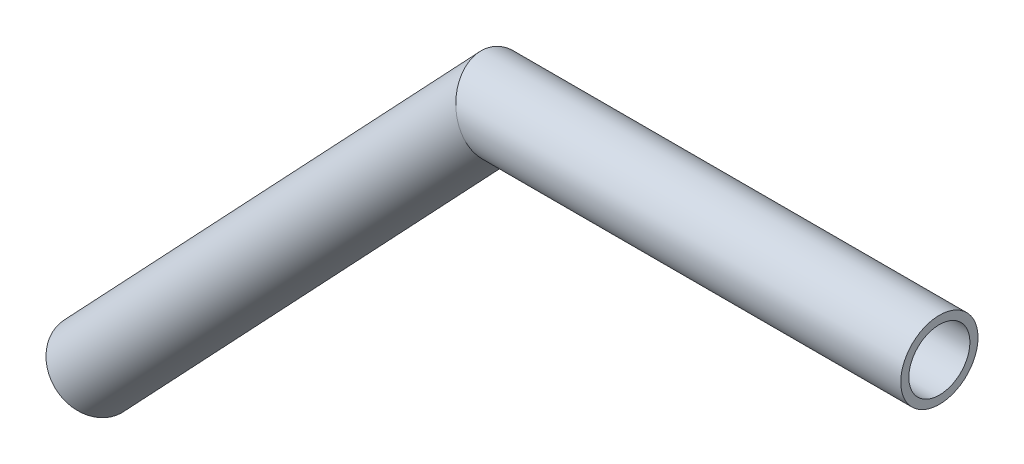
ISO-10303-21;
HEADER;
FILE_DESCRIPTION(('STEP AP214'),'2;1');
FILE_NAME('part.step','',(''),(''),'','','');
FILE_SCHEMA(('AUTOMOTIVE_DESIGN { 1 0 10303 214 1 1 1 1 }'));
ENDSEC;
DATA;
#1=APPLICATION_CONTEXT('core data for automotive mechanical design processes');
#2=APPLICATION_PROTOCOL_DEFINITION('international standard','automotive_design',2000,#1);
#3=PRODUCT_CONTEXT('',#1,'mechanical');
#4=PRODUCT('Part','Part','',(#3));
#5=PRODUCT_RELATED_PRODUCT_CATEGORY('part','',(#4));
#6=PRODUCT_DEFINITION_FORMATION('','',#4);
#7=PRODUCT_DEFINITION_CONTEXT('part definition',#1,'design');
#8=PRODUCT_DEFINITION('design','',#6,#7);
#9=PRODUCT_DEFINITION_SHAPE('','',#8);
#10=(LENGTH_UNIT() NAMED_UNIT(*) SI_UNIT(.MILLI.,.METRE.));
#11=(NAMED_UNIT(*) PLANE_ANGLE_UNIT() SI_UNIT($,.RADIAN.));
#12=(NAMED_UNIT(*) SI_UNIT($,.STERADIAN.) SOLID_ANGLE_UNIT());
#13=UNCERTAINTY_MEASURE_WITH_UNIT(LENGTH_MEASURE(1.E-05),#10,'distance_accuracy_value','');
#14=(GEOMETRIC_REPRESENTATION_CONTEXT(3) GLOBAL_UNCERTAINTY_ASSIGNED_CONTEXT((#13)) GLOBAL_UNIT_ASSIGNED_CONTEXT((#10,
#11,#12)) REPRESENTATION_CONTEXT('',''));
#15=CARTESIAN_POINT('',(0.,0.,0.));
#16=DIRECTION('',(0.,0.,1.));
#17=DIRECTION('',(1.,0.,0.));
#18=AXIS2_PLACEMENT_3D('',#15,#16,#17);
#19=CARTESIAN_POINT('',(-152.4,0.,0.));
#20=DIRECTION('',(-0.686453193247882,-0.727173991201408,0.));
#21=DIRECTION('',(0.727173991201408,-0.686453193247882,0.));
#22=AXIS2_PLACEMENT_3D('',#19,#20,#21);
#23=CYLINDRICAL_SURFACE('',#22,13.335);
#24=CARTESIAN_POINT('',(-152.4,0.,0.));
#25=DIRECTION('',(-0.91827370463492,-0.395946212731046,0.));
#26=DIRECTION('',(0.395946212731046,-0.918273704634921,0.));
#27=AXIS2_PLACEMENT_3D('',#24,#25,#26);
#28=ELLIPSE('',#27,14.5218140655586,13.335);
#29=CARTESIAN_POINT('',(-146.650142718758,-13.335,0.));
#30=VERTEX_POINT('',#29);
#31=EDGE_CURVE('E47',#30,#30,#28,.F.);
#32=ORIENTED_EDGE('',*,*,#31,.F.);
#33=EDGE_LOOP('',(#32));
#34=FACE_BOUND('',#33,.T.);
#35=CARTESIAN_POINT('',(-291.88728886797,-147.761755012126,0.));
#36=DIRECTION('',(-0.686453193247882,-0.727173991201408,0.));
#37=DIRECTION('',(0.727173991201408,-0.686453193247882,0.));
#38=AXIS2_PLACEMENT_3D('',#35,#36,#37);
#39=CIRCLE('',#38,13.335);
#40=CARTESIAN_POINT('',(-282.190423695299,-156.915608344087,0.));
#41=VERTEX_POINT('',#40);
#42=EDGE_CURVE('E11',#41,#41,#39,.T.);
#43=ORIENTED_EDGE('',*,*,#42,.F.);
#44=EDGE_LOOP('',(#43));
#45=FACE_BOUND('',#44,.T.);
#46=ADVANCED_FACE('F31',(#34,#45),#23,.T.);
#47=CARTESIAN_POINT('',(-152.4,0.,0.));
#48=DIRECTION('',(-0.686453193247882,-0.727173991201408,0.));
#49=DIRECTION('',(0.727173991201408,-0.686453193247882,0.));
#50=AXIS2_PLACEMENT_3D('',#47,#48,#49);
#51=CYLINDRICAL_SURFACE('',#50,10.541);
#52=CARTESIAN_POINT('',(-152.4,0.,0.));
#53=DIRECTION('',(-0.91827370463492,-0.395946212731046,0.));
#54=DIRECTION('',(0.395946212731046,-0.918273704634921,0.));
#55=AXIS2_PLACEMENT_3D('',#52,#53,#54);
#56=ELLIPSE('',#55,11.4791482613463,10.541);
#57=CARTESIAN_POINT('',(-147.854874720542,-10.541,0.));
#58=VERTEX_POINT('',#57);
#59=EDGE_CURVE('E43',#58,#58,#56,.F.);
#60=ORIENTED_EDGE('',*,*,#59,.T.);
#61=EDGE_LOOP('',(#60));
#62=FACE_BOUND('',#61,.T.);
#63=CARTESIAN_POINT('',(-291.88728886797,-147.761755012126,0.));
#64=DIRECTION('',(-0.686453193247882,-0.727173991201408,0.));
#65=DIRECTION('',(0.727173991201408,-0.686453193247882,0.));
#66=AXIS2_PLACEMENT_3D('',#63,#64,#65);
#67=CIRCLE('',#66,10.541);
#68=CARTESIAN_POINT('',(-284.222147826716,-154.997658122152,0.));
#69=VERTEX_POINT('',#68);
#70=EDGE_CURVE('E35',#69,#69,#67,.T.);
#71=ORIENTED_EDGE('',*,*,#70,.T.);
#72=EDGE_LOOP('',(#71));
#73=FACE_BOUND('',#72,.T.);
#74=ADVANCED_FACE('F33',(#62,#73),#51,.F.);
#75=CARTESIAN_POINT('',(-190.11707570849,0.,0.));
#76=DIRECTION('',(1.,0.,0.));
#77=DIRECTION('',(0.,1.,0.));
#78=AXIS2_PLACEMENT_3D('',#75,#76,#77);
#79=CYLINDRICAL_SURFACE('',#78,10.541);
#80=CARTESIAN_POINT('',(0.,0.,0.));
#81=DIRECTION('',(1.,0.,0.));
#82=DIRECTION('',(0.,0.,-1.));
#83=AXIS2_PLACEMENT_3D('',#80,#81,#82);
#84=CIRCLE('',#83,10.541);
#85=CARTESIAN_POINT('',(0.,0.,-10.541));
#86=VERTEX_POINT('',#85);
#87=EDGE_CURVE('E48',#86,#86,#84,.T.);
#88=ORIENTED_EDGE('',*,*,#87,.T.);
#89=EDGE_LOOP('',(#88));
#90=FACE_BOUND('',#89,.T.);
#91=ORIENTED_EDGE('',*,*,#59,.F.);
#92=EDGE_LOOP('',(#91));
#93=FACE_BOUND('',#92,.T.);
#94=ADVANCED_FACE('F63',(#90,#93),#79,.F.);
#95=CARTESIAN_POINT('',(0.,0.,0.));
#96=DIRECTION('',(1.,0.,0.));
#97=DIRECTION('',(0.,0.,-1.));
#98=AXIS2_PLACEMENT_3D('',#95,#96,#97);
#99=PLANE('',#98);
#100=ORIENTED_EDGE('',*,*,#87,.F.);
#101=EDGE_LOOP('',(#100));
#102=FACE_BOUND('',#101,.T.);
#103=CARTESIAN_POINT('',(0.,0.,0.));
#104=DIRECTION('',(1.,0.,0.));
#105=DIRECTION('',(0.,0.,-1.));
#106=AXIS2_PLACEMENT_3D('',#103,#104,#105);
#107=CIRCLE('',#106,13.335);
#108=CARTESIAN_POINT('',(0.,0.,-13.335));
#109=VERTEX_POINT('',#108);
#110=EDGE_CURVE('E51',#109,#109,#107,.T.);
#111=ORIENTED_EDGE('',*,*,#110,.T.);
#112=EDGE_LOOP('',(#111));
#113=FACE_BOUND('',#112,.T.);
#114=ADVANCED_FACE('F68',(#102,#113),#99,.T.);
#115=CARTESIAN_POINT('',(-190.11707570849,0.,0.));
#116=DIRECTION('',(1.,0.,0.));
#117=DIRECTION('',(0.,1.,0.));
#118=AXIS2_PLACEMENT_3D('',#115,#116,#117);
#119=CYLINDRICAL_SURFACE('',#118,13.335);
#120=ORIENTED_EDGE('',*,*,#110,.F.);
#121=EDGE_LOOP('',(#120));
#122=FACE_BOUND('',#121,.T.);
#123=ORIENTED_EDGE('',*,*,#31,.T.);
#124=EDGE_LOOP('',(#123));
#125=FACE_BOUND('',#124,.T.);
#126=ADVANCED_FACE('F56',(#122,#125),#119,.T.);
#127=CARTESIAN_POINT('',(-291.88728886797,-147.761755012126,0.));
#128=DIRECTION('',(-0.686453193247882,-0.727173991201408,0.));
#129=DIRECTION('',(0.727173991201408,-0.686453193247882,0.));
#130=AXIS2_PLACEMENT_3D('',#127,#128,#129);
#131=PLANE('',#130);
#132=ORIENTED_EDGE('',*,*,#70,.F.);
#133=EDGE_LOOP('',(#132));
#134=FACE_BOUND('',#133,.T.);
#135=ORIENTED_EDGE('',*,*,#42,.T.);
#136=EDGE_LOOP('',(#135));
#137=FACE_BOUND('',#136,.T.);
#138=ADVANCED_FACE('F72',(#134,#137),#131,.T.);
#139=CLOSED_SHELL('',(#46,#74,#94,#114,#126,#138));
#140=MANIFOLD_SOLID_BREP('B2',#139);
#141=ADVANCED_BREP_SHAPE_REPRESENTATION('',(#18,#140),#14);
#142=SHAPE_DEFINITION_REPRESENTATION(#9,#141);
ENDSEC;
END-ISO-10303-21;
